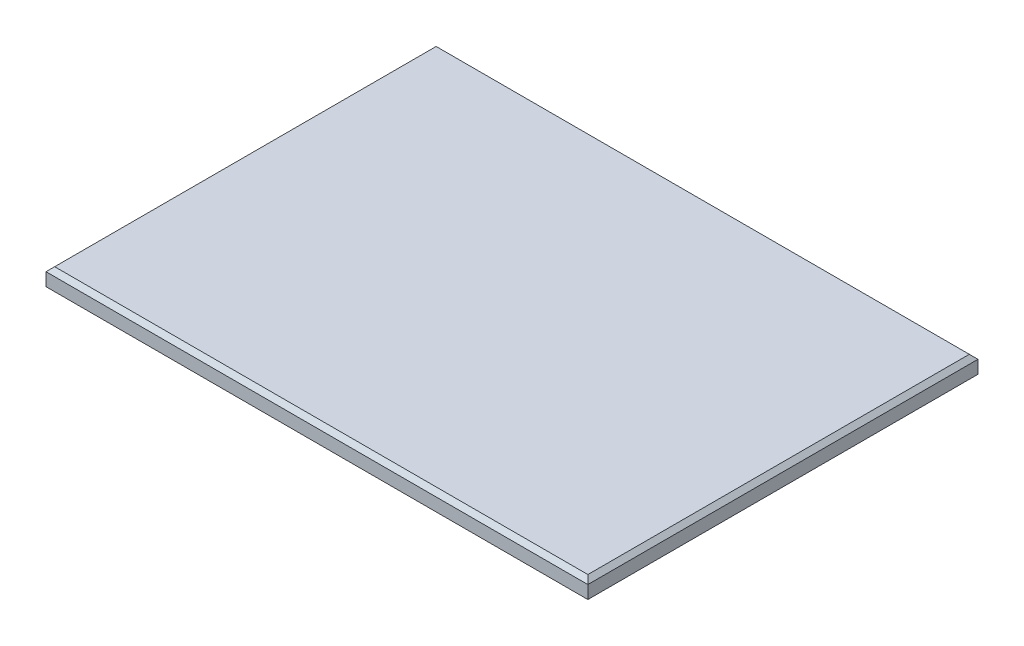
ISO-10303-21;
HEADER;
FILE_DESCRIPTION(('STEP AP214'),'2;1');
FILE_NAME('part.step','',(''),(''),'','','');
FILE_SCHEMA(('AUTOMOTIVE_DESIGN { 1 0 10303 214 1 1 1 1 }'));
ENDSEC;
DATA;
#1=APPLICATION_CONTEXT('core data for automotive mechanical design processes');
#2=APPLICATION_PROTOCOL_DEFINITION('international standard','automotive_design',2000,#1);
#3=PRODUCT_CONTEXT('',#1,'mechanical');
#4=PRODUCT('Part','Part','',(#3));
#5=PRODUCT_RELATED_PRODUCT_CATEGORY('part','',(#4));
#6=PRODUCT_DEFINITION_FORMATION('','',#4);
#7=PRODUCT_DEFINITION_CONTEXT('part definition',#1,'design');
#8=PRODUCT_DEFINITION('design','',#6,#7);
#9=PRODUCT_DEFINITION_SHAPE('','',#8);
#10=(LENGTH_UNIT() NAMED_UNIT(*) SI_UNIT(.MILLI.,.METRE.));
#11=(NAMED_UNIT(*) PLANE_ANGLE_UNIT() SI_UNIT($,.RADIAN.));
#12=(NAMED_UNIT(*) SI_UNIT($,.STERADIAN.) SOLID_ANGLE_UNIT());
#13=UNCERTAINTY_MEASURE_WITH_UNIT(LENGTH_MEASURE(1.E-05),#10,'distance_accuracy_value','');
#14=(GEOMETRIC_REPRESENTATION_CONTEXT(3) GLOBAL_UNCERTAINTY_ASSIGNED_CONTEXT((#13)) GLOBAL_UNIT_ASSIGNED_CONTEXT((#10,
#11,#12)) REPRESENTATION_CONTEXT('',''));
#15=CARTESIAN_POINT('',(0.,0.,0.));
#16=DIRECTION('',(0.,0.,1.));
#17=DIRECTION('',(1.,0.,0.));
#18=AXIS2_PLACEMENT_3D('',#15,#16,#17);
#19=CARTESIAN_POINT('',(0.,10.,0.));
#20=DIRECTION('',(1.,0.,0.));
#21=DIRECTION('',(0.,0.,-1.));
#22=AXIS2_PLACEMENT_3D('',#19,#20,#21);
#23=PLANE('',#22);
#24=DIRECTION('',(0.,-1.,0.));
#25=VECTOR('',#24,1.);
#26=CARTESIAN_POINT('',(0.,10.,-180.));
#27=LINE('',#26,#25);
#28=CARTESIAN_POINT('',(0.,8.00000000000003,-180.));
#29=VERTEX_POINT('',#28);
#30=CARTESIAN_POINT('',(0.,2.,-180.));
#31=VERTEX_POINT('',#30);
#32=EDGE_CURVE('E145',#29,#31,#27,.T.);
#33=ORIENTED_EDGE('',*,*,#32,.T.);
#34=DIRECTION('',(0.,0.,1.));
#35=VECTOR('',#34,1.);
#36=CARTESIAN_POINT('',(0.,2.,0.));
#37=LINE('',#36,#35);
#38=CARTESIAN_POINT('',(0.,2.,0.));
#39=VERTEX_POINT('',#38);
#40=EDGE_CURVE('E154',#31,#39,#37,.T.);
#41=ORIENTED_EDGE('',*,*,#40,.T.);
#42=DIRECTION('',(0.,-1.,0.));
#43=VECTOR('',#42,1.);
#44=CARTESIAN_POINT('',(0.,10.,0.));
#45=LINE('',#44,#43);
#46=CARTESIAN_POINT('',(0.,8.00000000000003,0.));
#47=VERTEX_POINT('',#46);
#48=EDGE_CURVE('E123',#47,#39,#45,.T.);
#49=ORIENTED_EDGE('',*,*,#48,.F.);
#50=DIRECTION('',(0.,0.,-1.));
#51=VECTOR('',#50,1.);
#52=CARTESIAN_POINT('',(0.,8.00000000000003,0.));
#53=LINE('',#52,#51);
#54=EDGE_CURVE('E156',#47,#29,#53,.T.);
#55=ORIENTED_EDGE('',*,*,#54,.T.);
#56=EDGE_LOOP('',(#33,#41,#49,#55));
#57=FACE_BOUND('',#56,.T.);
#58=ADVANCED_FACE('F35',(#57),#23,.F.);
#59=CARTESIAN_POINT('',(0.,10.,0.));
#60=DIRECTION('',(0.,0.,-1.));
#61=DIRECTION('',(-1.,0.,0.));
#62=AXIS2_PLACEMENT_3D('',#59,#60,#61);
#63=PLANE('',#62);
#64=ORIENTED_EDGE('',*,*,#48,.T.);
#65=DIRECTION('',(1.,0.,0.));
#66=VECTOR('',#65,1.);
#67=CARTESIAN_POINT('',(250.,2.,0.));
#68=LINE('',#67,#66);
#69=CARTESIAN_POINT('',(250.,2.,0.));
#70=VERTEX_POINT('',#69);
#71=EDGE_CURVE('E122',#39,#70,#68,.T.);
#72=ORIENTED_EDGE('',*,*,#71,.T.);
#73=DIRECTION('',(0.,-1.,0.));
#74=VECTOR('',#73,1.);
#75=CARTESIAN_POINT('',(250.,10.,0.));
#76=LINE('',#75,#74);
#77=CARTESIAN_POINT('',(250.,8.00000000000003,0.));
#78=VERTEX_POINT('',#77);
#79=EDGE_CURVE('E105',#78,#70,#76,.T.);
#80=ORIENTED_EDGE('',*,*,#79,.F.);
#81=DIRECTION('',(-1.,0.,0.));
#82=VECTOR('',#81,1.);
#83=CARTESIAN_POINT('',(0.,8.00000000000003,0.));
#84=LINE('',#83,#82);
#85=EDGE_CURVE('E119',#78,#47,#84,.T.);
#86=ORIENTED_EDGE('',*,*,#85,.T.);
#87=EDGE_LOOP('',(#64,#72,#80,#86));
#88=FACE_BOUND('',#87,.T.);
#89=ADVANCED_FACE('F118',(#88),#63,.F.);
#90=CARTESIAN_POINT('',(250.,10.,0.));
#91=DIRECTION('',(-1.,0.,0.));
#92=DIRECTION('',(0.,0.,1.));
#93=AXIS2_PLACEMENT_3D('',#90,#91,#92);
#94=PLANE('',#93);
#95=ORIENTED_EDGE('',*,*,#79,.T.);
#96=DIRECTION('',(0.,0.,-1.));
#97=VECTOR('',#96,1.);
#98=CARTESIAN_POINT('',(250.,2.,-180.));
#99=LINE('',#98,#97);
#100=CARTESIAN_POINT('',(250.,2.,-180.));
#101=VERTEX_POINT('',#100);
#102=EDGE_CURVE('E111',#70,#101,#99,.T.);
#103=ORIENTED_EDGE('',*,*,#102,.T.);
#104=DIRECTION('',(0.,-1.,0.));
#105=VECTOR('',#104,1.);
#106=CARTESIAN_POINT('',(250.,10.,-180.));
#107=LINE('',#106,#105);
#108=CARTESIAN_POINT('',(250.,8.00000000000003,-180.));
#109=VERTEX_POINT('',#108);
#110=EDGE_CURVE('E107',#109,#101,#107,.T.);
#111=ORIENTED_EDGE('',*,*,#110,.F.);
#112=DIRECTION('',(0.,0.,1.));
#113=VECTOR('',#112,1.);
#114=CARTESIAN_POINT('',(250.,8.00000000000003,0.));
#115=LINE('',#114,#113);
#116=EDGE_CURVE('E102',#109,#78,#115,.T.);
#117=ORIENTED_EDGE('',*,*,#116,.T.);
#118=EDGE_LOOP('',(#95,#103,#111,#117));
#119=FACE_BOUND('',#118,.T.);
#120=ADVANCED_FACE('F104',(#119),#94,.F.);
#121=CARTESIAN_POINT('',(0.,10.,-180.));
#122=DIRECTION('',(0.,0.,1.));
#123=DIRECTION('',(1.,0.,0.));
#124=AXIS2_PLACEMENT_3D('',#121,#122,#123);
#125=PLANE('',#124);
#126=ORIENTED_EDGE('',*,*,#110,.T.);
#127=DIRECTION('',(-1.,0.,0.));
#128=VECTOR('',#127,1.);
#129=CARTESIAN_POINT('',(0.,2.,-180.));
#130=LINE('',#129,#128);
#131=EDGE_CURVE('E158',#101,#31,#130,.T.);
#132=ORIENTED_EDGE('',*,*,#131,.T.);
#133=ORIENTED_EDGE('',*,*,#32,.F.);
#134=DIRECTION('',(1.,0.,0.));
#135=VECTOR('',#134,1.);
#136=CARTESIAN_POINT('',(0.,8.00000000000003,-180.));
#137=LINE('',#136,#135);
#138=EDGE_CURVE('E160',#29,#109,#137,.T.);
#139=ORIENTED_EDGE('',*,*,#138,.T.);
#140=EDGE_LOOP('',(#126,#132,#133,#139));
#141=FACE_BOUND('',#140,.T.);
#142=ADVANCED_FACE('F198',(#141),#125,.F.);
#143=CARTESIAN_POINT('',(0.,10.,0.));
#144=DIRECTION('',(0.,-1.,0.));
#145=DIRECTION('',(0.,0.,-1.));
#146=AXIS2_PLACEMENT_3D('',#143,#144,#145);
#147=PLANE('',#146);
#148=DIRECTION('',(0.,0.,-1.));
#149=VECTOR('',#148,1.);
#150=CARTESIAN_POINT('',(248.,10.,0.));
#151=LINE('',#150,#149);
#152=CARTESIAN_POINT('',(248.,10.,-2.));
#153=VERTEX_POINT('',#152);
#154=CARTESIAN_POINT('',(248.,10.,-178.));
#155=VERTEX_POINT('',#154);
#156=EDGE_CURVE('E45',#153,#155,#151,.T.);
#157=ORIENTED_EDGE('',*,*,#156,.T.);
#158=DIRECTION('',(-1.,0.,0.));
#159=VECTOR('',#158,1.);
#160=CARTESIAN_POINT('',(0.,10.,-178.));
#161=LINE('',#160,#159);
#162=CARTESIAN_POINT('',(2.,10.,-178.));
#163=VERTEX_POINT('',#162);
#164=EDGE_CURVE('E11',#155,#163,#161,.T.);
#165=ORIENTED_EDGE('',*,*,#164,.T.);
#166=DIRECTION('',(0.,0.,1.));
#167=VECTOR('',#166,1.);
#168=CARTESIAN_POINT('',(2.,10.,0.));
#169=LINE('',#168,#167);
#170=CARTESIAN_POINT('',(2.,10.,-2.));
#171=VERTEX_POINT('',#170);
#172=EDGE_CURVE('E152',#163,#171,#169,.T.);
#173=ORIENTED_EDGE('',*,*,#172,.T.);
#174=DIRECTION('',(1.,0.,0.));
#175=VECTOR('',#174,1.);
#176=CARTESIAN_POINT('',(0.,10.,-2.));
#177=LINE('',#176,#175);
#178=EDGE_CURVE('E56',#171,#153,#177,.T.);
#179=ORIENTED_EDGE('',*,*,#178,.T.);
#180=EDGE_LOOP('',(#157,#165,#173,#179));
#181=FACE_BOUND('',#180,.T.);
#182=ADVANCED_FACE('F204',(#181),#147,.F.);
#183=CARTESIAN_POINT('',(0.,0.,0.));
#184=DIRECTION('',(0.,-1.,0.));
#185=DIRECTION('',(0.,0.,-1.));
#186=AXIS2_PLACEMENT_3D('',#183,#184,#185);
#187=PLANE('',#186);
#188=DIRECTION('',(0.,0.,1.));
#189=VECTOR('',#188,1.);
#190=CARTESIAN_POINT('',(248.,0.,0.));
#191=LINE('',#190,#189);
#192=CARTESIAN_POINT('',(248.,0.,-178.));
#193=VERTEX_POINT('',#192);
#194=CARTESIAN_POINT('',(248.,0.,-1.99999999999997));
#195=VERTEX_POINT('',#194);
#196=EDGE_CURVE('E165',#193,#195,#191,.T.);
#197=ORIENTED_EDGE('',*,*,#196,.T.);
#198=DIRECTION('',(-1.,0.,0.));
#199=VECTOR('',#198,1.);
#200=CARTESIAN_POINT('',(0.,0.,-1.99999999999997));
#201=LINE('',#200,#199);
#202=CARTESIAN_POINT('',(1.99999999999997,0.,-1.99999999999997));
#203=VERTEX_POINT('',#202);
#204=EDGE_CURVE('E112',#195,#203,#201,.T.);
#205=ORIENTED_EDGE('',*,*,#204,.T.);
#206=DIRECTION('',(0.,0.,-1.));
#207=VECTOR('',#206,1.);
#208=CARTESIAN_POINT('',(1.99999999999997,0.,-180.));
#209=LINE('',#208,#207);
#210=CARTESIAN_POINT('',(1.99999999999997,0.,-178.));
#211=VERTEX_POINT('',#210);
#212=EDGE_CURVE('E169',#203,#211,#209,.T.);
#213=ORIENTED_EDGE('',*,*,#212,.T.);
#214=DIRECTION('',(1.,0.,0.));
#215=VECTOR('',#214,1.);
#216=CARTESIAN_POINT('',(250.,0.,-178.));
#217=LINE('',#216,#215);
#218=EDGE_CURVE('E167',#211,#193,#217,.T.);
#219=ORIENTED_EDGE('',*,*,#218,.T.);
#220=EDGE_LOOP('',(#197,#205,#213,#219));
#221=FACE_BOUND('',#220,.T.);
#222=ADVANCED_FACE('F206',(#221),#187,.T.);
#223=CARTESIAN_POINT('',(0.,2.,-180.));
#224=DIRECTION('',(0.,-0.707106781186543,-0.707106781186552));
#225=DIRECTION('',(1.,0.,0.));
#226=AXIS2_PLACEMENT_3D('',#223,#224,#225);
#227=PLANE('',#226);
#228=DIRECTION('',(-0.577350269189623,-0.577350269189631,0.577350269189623));
#229=VECTOR('',#228,1.);
#230=CARTESIAN_POINT('',(166.666666666667,-81.3333333333337,-96.6666666666674));
#231=LINE('',#230,#229);
#232=EDGE_CURVE('E146',#193,#101,#231,.F.);
#233=ORIENTED_EDGE('',*,*,#232,.F.);
#234=ORIENTED_EDGE('',*,*,#218,.F.);
#235=DIRECTION('',(0.577350269189623,-0.577350269189631,0.577350269189623));
#236=VECTOR('',#235,1.);
#237=CARTESIAN_POINT('',(59.9999999999994,-58.0000000000003,-120.000000000001));
#238=LINE('',#237,#236);
#239=EDGE_CURVE('E142',#31,#211,#238,.T.);
#240=ORIENTED_EDGE('',*,*,#239,.F.);
#241=ORIENTED_EDGE('',*,*,#131,.F.);
#242=EDGE_LOOP('',(#233,#234,#240,#241));
#243=FACE_BOUND('',#242,.T.);
#244=ADVANCED_FACE('F185',(#243),#227,.T.);
#245=CARTESIAN_POINT('',(0.,2.,0.));
#246=DIRECTION('',(-0.707106781186552,-0.707106781186543,0.));
#247=DIRECTION('',(0.,0.,-1.));
#248=AXIS2_PLACEMENT_3D('',#245,#246,#247);
#249=PLANE('',#248);
#250=ORIENTED_EDGE('',*,*,#239,.T.);
#251=ORIENTED_EDGE('',*,*,#212,.F.);
#252=DIRECTION('',(-0.577350269189623,0.577350269189631,0.577350269189623));
#253=VECTOR('',#252,1.);
#254=CARTESIAN_POINT('',(0.,2.,0.));
#255=LINE('',#254,#253);
#256=EDGE_CURVE('E133',#39,#203,#255,.F.);
#257=ORIENTED_EDGE('',*,*,#256,.F.);
#258=ORIENTED_EDGE('',*,*,#40,.F.);
#259=EDGE_LOOP('',(#250,#251,#257,#258));
#260=FACE_BOUND('',#259,.T.);
#261=ADVANCED_FACE('F189',(#260),#249,.T.);
#262=CARTESIAN_POINT('',(250.,2.,0.));
#263=DIRECTION('',(0.707106781186552,-0.707106781186543,0.));
#264=DIRECTION('',(0.,0.,1.));
#265=AXIS2_PLACEMENT_3D('',#262,#263,#264);
#266=PLANE('',#265);
#267=ORIENTED_EDGE('',*,*,#232,.T.);
#268=ORIENTED_EDGE('',*,*,#102,.F.);
#269=DIRECTION('',(-0.577350269189623,-0.577350269189631,-0.577350269189623));
#270=VECTOR('',#269,1.);
#271=CARTESIAN_POINT('',(250.,2.,0.));
#272=LINE('',#271,#270);
#273=EDGE_CURVE('E132',#195,#70,#272,.F.);
#274=ORIENTED_EDGE('',*,*,#273,.F.);
#275=ORIENTED_EDGE('',*,*,#196,.F.);
#276=EDGE_LOOP('',(#267,#268,#274,#275));
#277=FACE_BOUND('',#276,.T.);
#278=ADVANCED_FACE('F197',(#277),#266,.T.);
#279=CARTESIAN_POINT('',(0.,2.,0.));
#280=DIRECTION('',(0.,-0.707106781186543,0.707106781186552));
#281=DIRECTION('',(-1.,0.,0.));
#282=AXIS2_PLACEMENT_3D('',#279,#280,#281);
#283=PLANE('',#282);
#284=ORIENTED_EDGE('',*,*,#256,.T.);
#285=ORIENTED_EDGE('',*,*,#204,.F.);
#286=ORIENTED_EDGE('',*,*,#273,.T.);
#287=ORIENTED_EDGE('',*,*,#71,.F.);
#288=EDGE_LOOP('',(#284,#285,#286,#287));
#289=FACE_BOUND('',#288,.T.);
#290=ADVANCED_FACE('F192',(#289),#283,.T.);
#291=CARTESIAN_POINT('',(0.,10.,-2.));
#292=DIRECTION('',(0.,-0.707106781186552,-0.707106781186543));
#293=DIRECTION('',(1.,0.,0.));
#294=AXIS2_PLACEMENT_3D('',#291,#292,#293);
#295=PLANE('',#294);
#296=DIRECTION('',(0.577350269189628,0.57735026918962,-0.577350269189628));
#297=VECTOR('',#296,1.);
#298=CARTESIAN_POINT('',(1.33333333333333,9.33333333333334,-1.33333333333333));
#299=LINE('',#298,#297);
#300=EDGE_CURVE('E128',#47,#171,#299,.T.);
#301=ORIENTED_EDGE('',*,*,#300,.F.);
#302=ORIENTED_EDGE('',*,*,#85,.F.);
#303=DIRECTION('',(-0.577350269189628,0.57735026918962,-0.577350269189628));
#304=VECTOR('',#303,1.);
#305=CARTESIAN_POINT('',(165.333333333333,92.6666666666663,-84.6666666666674));
#306=LINE('',#305,#304);
#307=EDGE_CURVE('E40',#153,#78,#306,.F.);
#308=ORIENTED_EDGE('',*,*,#307,.F.);
#309=ORIENTED_EDGE('',*,*,#178,.F.);
#310=EDGE_LOOP('',(#301,#302,#308,#309));
#311=FACE_BOUND('',#310,.T.);
#312=ADVANCED_FACE('F38',(#311),#295,.F.);
#313=CARTESIAN_POINT('',(248.,10.,0.));
#314=DIRECTION('',(-0.707106781186543,-0.707106781186552,0.));
#315=DIRECTION('',(0.,0.,-1.));
#316=AXIS2_PLACEMENT_3D('',#313,#314,#315);
#317=PLANE('',#316);
#318=ORIENTED_EDGE('',*,*,#307,.T.);
#319=ORIENTED_EDGE('',*,*,#116,.F.);
#320=DIRECTION('',(-0.577350269189628,0.57735026918962,0.577350269189628));
#321=VECTOR('',#320,1.);
#322=CARTESIAN_POINT('',(188.666666666666,69.3333333333331,-118.666666666666));
#323=LINE('',#322,#321);
#324=EDGE_CURVE('E135',#155,#109,#323,.F.);
#325=ORIENTED_EDGE('',*,*,#324,.F.);
#326=ORIENTED_EDGE('',*,*,#156,.F.);
#327=EDGE_LOOP('',(#318,#319,#325,#326));
#328=FACE_BOUND('',#327,.T.);
#329=ADVANCED_FACE('F131',(#328),#317,.F.);
#330=CARTESIAN_POINT('',(2.,10.,0.));
#331=DIRECTION('',(0.707106781186543,-0.707106781186552,0.));
#332=DIRECTION('',(0.,0.,1.));
#333=AXIS2_PLACEMENT_3D('',#330,#331,#332);
#334=PLANE('',#333);
#335=ORIENTED_EDGE('',*,*,#300,.T.);
#336=ORIENTED_EDGE('',*,*,#172,.F.);
#337=DIRECTION('',(-0.577350269189628,-0.57735026918962,-0.577350269189628));
#338=VECTOR('',#337,1.);
#339=CARTESIAN_POINT('',(61.3333333333339,69.3333333333331,-118.666666666666));
#340=LINE('',#339,#338);
#341=EDGE_CURVE('E138',#29,#163,#340,.F.);
#342=ORIENTED_EDGE('',*,*,#341,.F.);
#343=ORIENTED_EDGE('',*,*,#54,.F.);
#344=EDGE_LOOP('',(#335,#336,#342,#343));
#345=FACE_BOUND('',#344,.T.);
#346=ADVANCED_FACE('F203',(#345),#334,.F.);
#347=CARTESIAN_POINT('',(0.,10.,-178.));
#348=DIRECTION('',(0.,-0.707106781186552,0.707106781186543));
#349=DIRECTION('',(-1.,0.,0.));
#350=AXIS2_PLACEMENT_3D('',#347,#348,#349);
#351=PLANE('',#350);
#352=ORIENTED_EDGE('',*,*,#324,.T.);
#353=ORIENTED_EDGE('',*,*,#138,.F.);
#354=ORIENTED_EDGE('',*,*,#341,.T.);
#355=ORIENTED_EDGE('',*,*,#164,.F.);
#356=EDGE_LOOP('',(#352,#353,#354,#355));
#357=FACE_BOUND('',#356,.T.);
#358=ADVANCED_FACE('F201',(#357),#351,.F.);
#359=CLOSED_SHELL('',(#58,#89,#120,#142,#182,#222,#244,#261,#278,#290,#312,#329,#346,#358));
#360=MANIFOLD_SOLID_BREP('B2',#359);
#361=ADVANCED_BREP_SHAPE_REPRESENTATION('',(#18,#360),#14);
#362=SHAPE_DEFINITION_REPRESENTATION(#9,#361);
ENDSEC;
END-ISO-10303-21;
